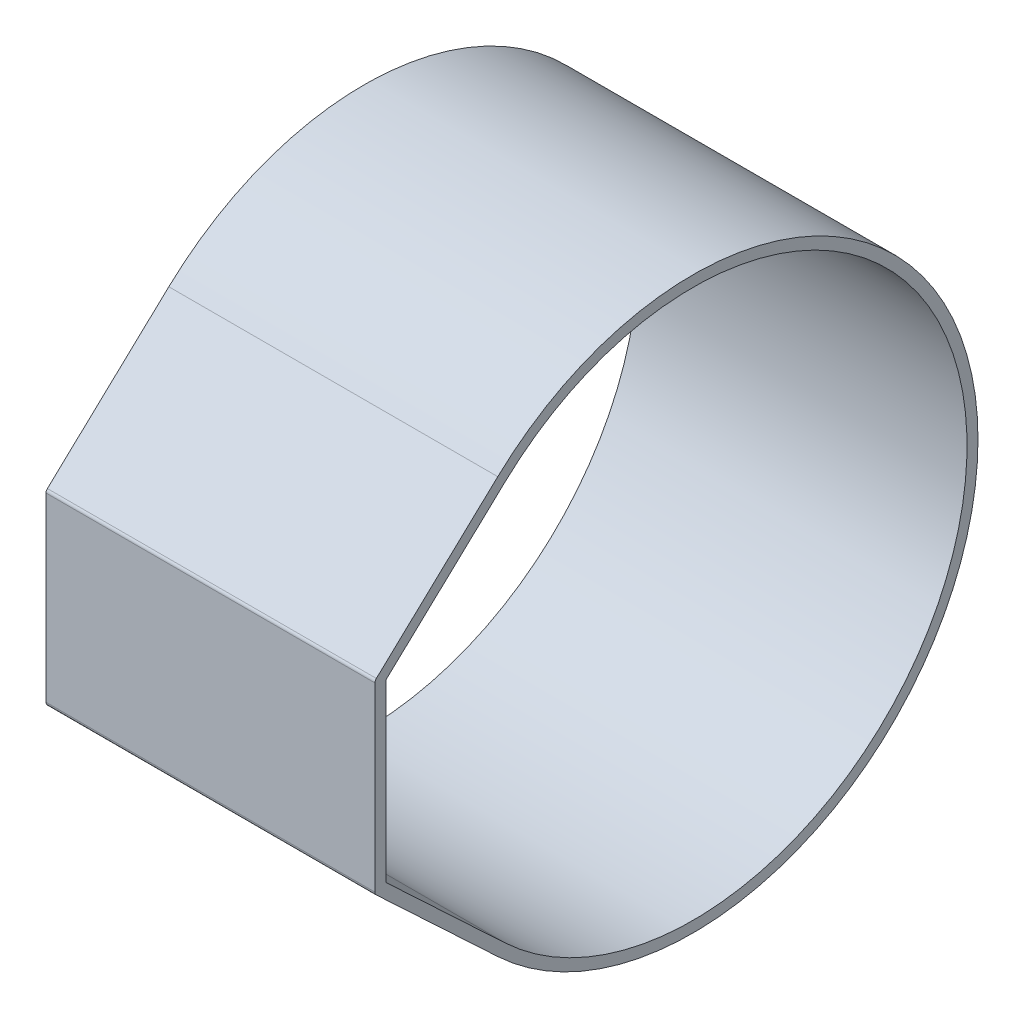
ISO-10303-21;
HEADER;
FILE_DESCRIPTION(('STEP AP214'),'2;1');
FILE_NAME('part.step','',(''),(''),'','','');
FILE_SCHEMA(('AUTOMOTIVE_DESIGN { 1 0 10303 214 1 1 1 1 }'));
ENDSEC;
DATA;
#1=APPLICATION_CONTEXT('core data for automotive mechanical design processes');
#2=APPLICATION_PROTOCOL_DEFINITION('international standard','automotive_design',2000,#1);
#3=PRODUCT_CONTEXT('',#1,'mechanical');
#4=PRODUCT('Part','Part','',(#3));
#5=PRODUCT_RELATED_PRODUCT_CATEGORY('part','',(#4));
#6=PRODUCT_DEFINITION_FORMATION('','',#4);
#7=PRODUCT_DEFINITION_CONTEXT('part definition',#1,'design');
#8=PRODUCT_DEFINITION('design','',#6,#7);
#9=PRODUCT_DEFINITION_SHAPE('','',#8);
#10=(LENGTH_UNIT() NAMED_UNIT(*) SI_UNIT(.MILLI.,.METRE.));
#11=(NAMED_UNIT(*) PLANE_ANGLE_UNIT() SI_UNIT($,.RADIAN.));
#12=(NAMED_UNIT(*) SI_UNIT($,.STERADIAN.) SOLID_ANGLE_UNIT());
#13=UNCERTAINTY_MEASURE_WITH_UNIT(LENGTH_MEASURE(1.E-05),#10,'distance_accuracy_value','');
#14=(GEOMETRIC_REPRESENTATION_CONTEXT(3) GLOBAL_UNCERTAINTY_ASSIGNED_CONTEXT((#13)) GLOBAL_UNIT_ASSIGNED_CONTEXT((#10,
#11,#12)) REPRESENTATION_CONTEXT('',''));
#15=CARTESIAN_POINT('',(0.,0.,0.));
#16=DIRECTION('',(0.,0.,1.));
#17=DIRECTION('',(1.,0.,0.));
#18=AXIS2_PLACEMENT_3D('',#15,#16,#17);
#19=CARTESIAN_POINT('',(-139.007123161513,667.332012286222,-386.357743681072));
#20=DIRECTION('',(-1.,0.,0.));
#21=DIRECTION('',(0.,0.,1.));
#22=AXIS2_PLACEMENT_3D('',#19,#20,#21);
#23=CYLINDRICAL_SURFACE('',#22,13.);
#24=CARTESIAN_POINT('',(-154.007123161513,667.332012286222,-386.357743681072));
#25=DIRECTION('',(-1.,0.,0.));
#26=DIRECTION('',(0.,0.,1.));
#27=AXIS2_PLACEMENT_3D('',#24,#25,#26);
#28=CIRCLE('',#27,13.);
#29=CARTESIAN_POINT('',(-154.007123161513,676.808049039048,-377.458039896165));
#30=VERTEX_POINT('',#29);
#31=CARTESIAN_POINT('',(-154.007123161513,657.855975533396,-377.458039896165));
#32=VERTEX_POINT('',#31);
#33=EDGE_CURVE('E164',#30,#32,#28,.T.);
#34=ORIENTED_EDGE('',*,*,#33,.F.);
#35=DIRECTION('',(-1.,0.,0.));
#36=VECTOR('',#35,1.);
#37=CARTESIAN_POINT('',(-139.007123161513,676.808049039048,-377.458039896165));
#38=LINE('',#37,#36);
#39=CARTESIAN_POINT('',(-139.007123161513,676.808049039048,-377.458039896165));
#40=VERTEX_POINT('',#39);
#41=EDGE_CURVE('E11',#40,#30,#38,.T.);
#42=ORIENTED_EDGE('',*,*,#41,.F.);
#43=CARTESIAN_POINT('',(-139.007123161513,667.332012286222,-386.357743681072));
#44=DIRECTION('',(-1.,0.,0.));
#45=DIRECTION('',(0.,0.,1.));
#46=AXIS2_PLACEMENT_3D('',#43,#44,#45);
#47=CIRCLE('',#46,13.);
#48=CARTESIAN_POINT('',(-139.007123161513,657.855975533396,-377.458039896165));
#49=VERTEX_POINT('',#48);
#50=EDGE_CURVE('E170',#40,#49,#47,.T.);
#51=ORIENTED_EDGE('',*,*,#50,.T.);
#52=DIRECTION('',(-1.,0.,0.));
#53=VECTOR('',#52,1.);
#54=CARTESIAN_POINT('',(-139.007123161513,657.855975533396,-377.458039896165));
#55=LINE('',#54,#53);
#56=EDGE_CURVE('E46',#49,#32,#55,.T.);
#57=ORIENTED_EDGE('',*,*,#56,.T.);
#58=EDGE_LOOP('',(#34,#42,#51,#57));
#59=FACE_BOUND('',#58,.T.);
#60=ADVANCED_FACE('F43',(#59),#23,.T.);
#61=CARTESIAN_POINT('',(-139.007123161513,671.607607945467,-371.920825161304));
#62=DIRECTION('',(0.,0.728925904063567,0.684592598838982));
#63=DIRECTION('',(0.,-0.684592598838982,0.728925904063567));
#64=AXIS2_PLACEMENT_3D('',#61,#62,#63);
#65=PLANE('',#64);
#66=DIRECTION('',(0.,0.684592598838982,-0.728925904063567));
#67=VECTOR('',#66,1.);
#68=CARTESIAN_POINT('',(-154.007123161513,671.607607945467,-371.920825161304));
#69=LINE('',#68,#67);
#70=CARTESIAN_POINT('',(-154.007123161513,671.607607945467,-371.920825161304));
#71=VERTEX_POINT('',#70);
#72=EDGE_CURVE('E175',#71,#30,#69,.T.);
#73=ORIENTED_EDGE('',*,*,#72,.F.);
#74=DIRECTION('',(-1.,0.,0.));
#75=VECTOR('',#74,1.);
#76=CARTESIAN_POINT('',(-139.007123161513,671.607607945467,-371.920825161304));
#77=LINE('',#76,#75);
#78=CARTESIAN_POINT('',(-139.007123161513,671.607607945467,-371.920825161304));
#79=VERTEX_POINT('',#78);
#80=EDGE_CURVE('E52',#79,#71,#77,.T.);
#81=ORIENTED_EDGE('',*,*,#80,.F.);
#82=DIRECTION('',(0.,0.684592598838982,-0.728925904063567));
#83=VECTOR('',#82,1.);
#84=CARTESIAN_POINT('',(-139.007123161513,671.607607945467,-371.920825161304));
#85=LINE('',#84,#83);
#86=EDGE_CURVE('E191',#79,#40,#85,.T.);
#87=ORIENTED_EDGE('',*,*,#86,.T.);
#88=ORIENTED_EDGE('',*,*,#41,.T.);
#89=EDGE_LOOP('',(#73,#81,#87,#88));
#90=FACE_BOUND('',#89,.T.);
#91=ADVANCED_FACE('F240',(#90),#65,.T.);
#92=CARTESIAN_POINT('',(-139.007123161513,671.461822764654,-372.057743681072));
#93=DIRECTION('',(-1.,0.,0.));
#94=DIRECTION('',(0.,0.,1.));
#95=AXIS2_PLACEMENT_3D('',#92,#93,#94);
#96=CYLINDRICAL_SURFACE('',#95,0.200000000000123);
#97=CARTESIAN_POINT('',(-154.007123161513,671.461822764654,-372.057743681072));
#98=DIRECTION('',(-1.,0.,0.));
#99=DIRECTION('',(0.,0.,1.));
#100=AXIS2_PLACEMENT_3D('',#97,#98,#99);
#101=CIRCLE('',#100,0.200000000000123);
#102=CARTESIAN_POINT('',(-154.007123161513,671.461822764654,-371.857743681072));
#103=VERTEX_POINT('',#102);
#104=EDGE_CURVE('E210',#103,#71,#101,.T.);
#105=ORIENTED_EDGE('',*,*,#104,.F.);
#106=DIRECTION('',(-1.,0.,0.));
#107=VECTOR('',#106,1.);
#108=CARTESIAN_POINT('',(-139.007123161513,671.461822764654,-371.857743681072));
#109=LINE('',#108,#107);
#110=CARTESIAN_POINT('',(-139.007123161513,671.461822764654,-371.857743681072));
#111=VERTEX_POINT('',#110);
#112=EDGE_CURVE('E219',#111,#103,#109,.T.);
#113=ORIENTED_EDGE('',*,*,#112,.F.);
#114=CARTESIAN_POINT('',(-139.007123161513,671.461822764654,-372.057743681072));
#115=DIRECTION('',(-1.,0.,0.));
#116=DIRECTION('',(0.,0.,1.));
#117=AXIS2_PLACEMENT_3D('',#114,#115,#116);
#118=CIRCLE('',#117,0.200000000000123);
#119=EDGE_CURVE('E187',#111,#79,#118,.T.);
#120=ORIENTED_EDGE('',*,*,#119,.T.);
#121=ORIENTED_EDGE('',*,*,#80,.T.);
#122=EDGE_LOOP('',(#105,#113,#120,#121));
#123=FACE_BOUND('',#122,.T.);
#124=ADVANCED_FACE('F251',(#123),#96,.T.);
#125=CARTESIAN_POINT('',(-139.007123161513,663.202201807789,-371.857743681072));
#126=DIRECTION('',(0.,0.,1.));
#127=DIRECTION('',(0.,-1.,0.));
#128=AXIS2_PLACEMENT_3D('',#125,#126,#127);
#129=PLANE('',#128);
#130=DIRECTION('',(0.,1.,0.));
#131=VECTOR('',#130,1.);
#132=CARTESIAN_POINT('',(-154.007123161513,663.202201807789,-371.857743681072));
#133=LINE('',#132,#131);
#134=CARTESIAN_POINT('',(-154.007123161513,663.202201807789,-371.857743681072));
#135=VERTEX_POINT('',#134);
#136=EDGE_CURVE('E206',#135,#103,#133,.T.);
#137=ORIENTED_EDGE('',*,*,#136,.F.);
#138=DIRECTION('',(-1.,0.,0.));
#139=VECTOR('',#138,1.);
#140=CARTESIAN_POINT('',(-139.007123161513,663.202201807789,-371.857743681072));
#141=LINE('',#140,#139);
#142=CARTESIAN_POINT('',(-139.007123161513,663.202201807789,-371.857743681072));
#143=VERTEX_POINT('',#142);
#144=EDGE_CURVE('E222',#143,#135,#141,.T.);
#145=ORIENTED_EDGE('',*,*,#144,.F.);
#146=DIRECTION('',(0.,1.,0.));
#147=VECTOR('',#146,1.);
#148=CARTESIAN_POINT('',(-139.007123161513,663.202201807789,-371.857743681072));
#149=LINE('',#148,#147);
#150=EDGE_CURVE('E183',#143,#111,#149,.T.);
#151=ORIENTED_EDGE('',*,*,#150,.T.);
#152=ORIENTED_EDGE('',*,*,#112,.T.);
#153=EDGE_LOOP('',(#137,#145,#151,#152));
#154=FACE_BOUND('',#153,.T.);
#155=ADVANCED_FACE('F249',(#154),#129,.T.);
#156=CARTESIAN_POINT('',(-139.007123161513,663.202201807789,-372.057743681072));
#157=DIRECTION('',(-1.,0.,0.));
#158=DIRECTION('',(0.,0.,1.));
#159=AXIS2_PLACEMENT_3D('',#156,#157,#158);
#160=CYLINDRICAL_SURFACE('',#159,0.200000000000012);
#161=CARTESIAN_POINT('',(-154.007123161513,663.202201807789,-372.057743681072));
#162=DIRECTION('',(-1.,0.,0.));
#163=DIRECTION('',(0.,0.,1.));
#164=AXIS2_PLACEMENT_3D('',#161,#162,#163);
#165=CIRCLE('',#164,0.200000000000012);
#166=CARTESIAN_POINT('',(-154.007123161513,663.056416626977,-371.920825161304));
#167=VERTEX_POINT('',#166);
#168=EDGE_CURVE('E202',#167,#135,#165,.T.);
#169=ORIENTED_EDGE('',*,*,#168,.F.);
#170=DIRECTION('',(-1.,0.,0.));
#171=VECTOR('',#170,1.);
#172=CARTESIAN_POINT('',(-139.007123161513,663.056416626977,-371.920825161304));
#173=LINE('',#172,#171);
#174=CARTESIAN_POINT('',(-139.007123161513,663.056416626977,-371.920825161304));
#175=VERTEX_POINT('',#174);
#176=EDGE_CURVE('E224',#175,#167,#173,.T.);
#177=ORIENTED_EDGE('',*,*,#176,.F.);
#178=CARTESIAN_POINT('',(-139.007123161513,663.202201807789,-372.057743681072));
#179=DIRECTION('',(-1.,0.,0.));
#180=DIRECTION('',(0.,0.,1.));
#181=AXIS2_PLACEMENT_3D('',#178,#179,#180);
#182=CIRCLE('',#181,0.200000000000012);
#183=EDGE_CURVE('E179',#175,#143,#182,.T.);
#184=ORIENTED_EDGE('',*,*,#183,.T.);
#185=ORIENTED_EDGE('',*,*,#144,.T.);
#186=EDGE_LOOP('',(#169,#177,#184,#185));
#187=FACE_BOUND('',#186,.T.);
#188=ADVANCED_FACE('F246',(#187),#160,.T.);
#189=CARTESIAN_POINT('',(-139.007123161513,657.855975533396,-377.458039896165));
#190=DIRECTION('',(0.,-0.72892590406359,0.684592598838958));
#191=DIRECTION('',(0.,-0.684592598838958,-0.72892590406359));
#192=AXIS2_PLACEMENT_3D('',#189,#190,#191);
#193=PLANE('',#192);
#194=DIRECTION('',(0.,0.684592598838958,0.72892590406359));
#195=VECTOR('',#194,1.);
#196=CARTESIAN_POINT('',(-154.007123161513,657.855975533396,-377.458039896165));
#197=LINE('',#196,#195);
#198=EDGE_CURVE('E198',#32,#167,#197,.T.);
#199=ORIENTED_EDGE('',*,*,#198,.F.);
#200=ORIENTED_EDGE('',*,*,#56,.F.);
#201=DIRECTION('',(0.,0.684592598838958,0.72892590406359));
#202=VECTOR('',#201,1.);
#203=CARTESIAN_POINT('',(-139.007123161513,657.855975533396,-377.458039896165));
#204=LINE('',#203,#202);
#205=EDGE_CURVE('E174',#49,#175,#204,.T.);
#206=ORIENTED_EDGE('',*,*,#205,.T.);
#207=ORIENTED_EDGE('',*,*,#176,.T.);
#208=EDGE_LOOP('',(#199,#200,#206,#207));
#209=FACE_BOUND('',#208,.T.);
#210=ADVANCED_FACE('F234',(#209),#193,.T.);
#211=CARTESIAN_POINT('',(-139.007123161513,667.332012286222,-386.357743681072));
#212=DIRECTION('',(-1.,0.,0.));
#213=DIRECTION('',(0.,0.,1.));
#214=AXIS2_PLACEMENT_3D('',#211,#212,#213);
#215=PLANE('',#214);
#216=DIRECTION('',(0.,0.684592598838942,-0.728925904063605));
#217=VECTOR('',#216,1.);
#218=CARTESIAN_POINT('',(-139.007123161513,676.443586087017,-377.800336195585));
#219=LINE('',#218,#217);
#220=CARTESIAN_POINT('',(-139.007123161513,671.332012286222,-372.357743681072));
#221=VERTEX_POINT('',#220);
#222=CARTESIAN_POINT('',(-139.007123161513,676.443586087017,-377.800336195585));
#223=VERTEX_POINT('',#222);
#224=EDGE_CURVE('E130',#221,#223,#219,.T.);
#225=ORIENTED_EDGE('',*,*,#224,.T.);
#226=CARTESIAN_POINT('',(-139.007123161513,667.332012286222,-386.357743681072));
#227=DIRECTION('',(-1.,0.,0.));
#228=DIRECTION('',(0.,0.,-1.));
#229=AXIS2_PLACEMENT_3D('',#226,#227,#228);
#230=CIRCLE('',#229,12.4999999999998);
#231=CARTESIAN_POINT('',(-139.007123161513,658.220438485427,-377.800336195585));
#232=VERTEX_POINT('',#231);
#233=EDGE_CURVE('E123',#223,#232,#230,.T.);
#234=ORIENTED_EDGE('',*,*,#233,.T.);
#235=DIRECTION('',(0.,0.684592598838983,0.728925904063566));
#236=VECTOR('',#235,1.);
#237=CARTESIAN_POINT('',(-139.007123161513,663.332012286222,-372.357743681072));
#238=LINE('',#237,#236);
#239=CARTESIAN_POINT('',(-139.007123161513,663.332012286222,-372.357743681072));
#240=VERTEX_POINT('',#239);
#241=EDGE_CURVE('E133',#232,#240,#238,.T.);
#242=ORIENTED_EDGE('',*,*,#241,.T.);
#243=DIRECTION('',(0.,1.,0.));
#244=VECTOR('',#243,1.);
#245=CARTESIAN_POINT('',(-139.007123161513,671.332012286222,-372.357743681072));
#246=LINE('',#245,#244);
#247=EDGE_CURVE('E60',#240,#221,#246,.T.);
#248=ORIENTED_EDGE('',*,*,#247,.T.);
#249=EDGE_LOOP('',(#225,#234,#242,#248));
#250=FACE_BOUND('',#249,.T.);
#251=ORIENTED_EDGE('',*,*,#50,.F.);
#252=ORIENTED_EDGE('',*,*,#86,.F.);
#253=ORIENTED_EDGE('',*,*,#119,.F.);
#254=ORIENTED_EDGE('',*,*,#150,.F.);
#255=ORIENTED_EDGE('',*,*,#183,.F.);
#256=ORIENTED_EDGE('',*,*,#205,.F.);
#257=EDGE_LOOP('',(#251,#252,#253,#254,#255,#256));
#258=FACE_BOUND('',#257,.T.);
#259=ADVANCED_FACE('F138',(#250,#258),#215,.F.);
#260=CARTESIAN_POINT('',(-154.007123161513,667.332012286222,-386.357743681072));
#261=DIRECTION('',(-1.,0.,0.));
#262=DIRECTION('',(0.,0.,1.));
#263=AXIS2_PLACEMENT_3D('',#260,#261,#262);
#264=PLANE('',#263);
#265=CARTESIAN_POINT('',(-154.007123161513,667.332012286222,-386.357743681072));
#266=DIRECTION('',(-1.,0.,0.));
#267=DIRECTION('',(0.,0.,-1.));
#268=AXIS2_PLACEMENT_3D('',#265,#266,#267);
#269=CIRCLE('',#268,12.4999999999998);
#270=CARTESIAN_POINT('',(-154.007123161513,676.443586087017,-377.800336195585));
#271=VERTEX_POINT('',#270);
#272=CARTESIAN_POINT('',(-154.007123161513,658.220438485427,-377.800336195585));
#273=VERTEX_POINT('',#272);
#274=EDGE_CURVE('E68',#271,#273,#269,.T.);
#275=ORIENTED_EDGE('',*,*,#274,.F.);
#276=DIRECTION('',(0.,0.684592598838942,-0.728925904063605));
#277=VECTOR('',#276,1.);
#278=CARTESIAN_POINT('',(-154.007123161513,676.443586087017,-377.800336195585));
#279=LINE('',#278,#277);
#280=CARTESIAN_POINT('',(-154.007123161513,671.332012286222,-372.357743681072));
#281=VERTEX_POINT('',#280);
#282=EDGE_CURVE('E142',#281,#271,#279,.T.);
#283=ORIENTED_EDGE('',*,*,#282,.F.);
#284=DIRECTION('',(0.,1.,0.));
#285=VECTOR('',#284,1.);
#286=CARTESIAN_POINT('',(-154.007123161513,671.332012286222,-372.357743681072));
#287=LINE('',#286,#285);
#288=CARTESIAN_POINT('',(-154.007123161513,663.332012286222,-372.357743681072));
#289=VERTEX_POINT('',#288);
#290=EDGE_CURVE('E146',#289,#281,#287,.T.);
#291=ORIENTED_EDGE('',*,*,#290,.F.);
#292=DIRECTION('',(0.,0.684592598838983,0.728925904063566));
#293=VECTOR('',#292,1.);
#294=CARTESIAN_POINT('',(-154.007123161513,663.332012286222,-372.357743681072));
#295=LINE('',#294,#293);
#296=EDGE_CURVE('E155',#273,#289,#295,.T.);
#297=ORIENTED_EDGE('',*,*,#296,.F.);
#298=EDGE_LOOP('',(#275,#283,#291,#297));
#299=FACE_BOUND('',#298,.T.);
#300=ORIENTED_EDGE('',*,*,#33,.T.);
#301=ORIENTED_EDGE('',*,*,#198,.T.);
#302=ORIENTED_EDGE('',*,*,#168,.T.);
#303=ORIENTED_EDGE('',*,*,#136,.T.);
#304=ORIENTED_EDGE('',*,*,#104,.T.);
#305=ORIENTED_EDGE('',*,*,#72,.T.);
#306=EDGE_LOOP('',(#300,#301,#302,#303,#304,#305));
#307=FACE_BOUND('',#306,.T.);
#308=ADVANCED_FACE('F236',(#299,#307),#264,.T.);
#309=CARTESIAN_POINT('',(-139.007123161513,667.332012286222,-386.357743681072));
#310=DIRECTION('',(-1.,0.,0.));
#311=DIRECTION('',(0.,0.,1.));
#312=AXIS2_PLACEMENT_3D('',#309,#310,#311);
#313=CYLINDRICAL_SURFACE('',#312,12.4999999999998);
#314=ORIENTED_EDGE('',*,*,#274,.T.);
#315=DIRECTION('',(-1.,0.,0.));
#316=VECTOR('',#315,1.);
#317=CARTESIAN_POINT('',(-139.007123161513,658.220438485427,-377.800336195585));
#318=LINE('',#317,#316);
#319=EDGE_CURVE('E119',#232,#273,#318,.T.);
#320=ORIENTED_EDGE('',*,*,#319,.F.);
#321=ORIENTED_EDGE('',*,*,#233,.F.);
#322=DIRECTION('',(-1.,0.,0.));
#323=VECTOR('',#322,1.);
#324=CARTESIAN_POINT('',(-139.007123161513,676.443586087017,-377.800336195585));
#325=LINE('',#324,#323);
#326=EDGE_CURVE('E161',#223,#271,#325,.T.);
#327=ORIENTED_EDGE('',*,*,#326,.T.);
#328=EDGE_LOOP('',(#314,#320,#321,#327));
#329=FACE_BOUND('',#328,.T.);
#330=ADVANCED_FACE('F121',(#329),#313,.F.);
#331=CARTESIAN_POINT('',(-139.007123161513,676.443586087017,-377.800336195585));
#332=DIRECTION('',(0.,0.728925904063605,0.684592598838942));
#333=DIRECTION('',(0.,-0.684592598838942,0.728925904063605));
#334=AXIS2_PLACEMENT_3D('',#331,#332,#333);
#335=PLANE('',#334);
#336=ORIENTED_EDGE('',*,*,#282,.T.);
#337=ORIENTED_EDGE('',*,*,#326,.F.);
#338=ORIENTED_EDGE('',*,*,#224,.F.);
#339=DIRECTION('',(-1.,0.,0.));
#340=VECTOR('',#339,1.);
#341=CARTESIAN_POINT('',(-139.007123161513,671.332012286222,-372.357743681072));
#342=LINE('',#341,#340);
#343=EDGE_CURVE('E165',#221,#281,#342,.T.);
#344=ORIENTED_EDGE('',*,*,#343,.T.);
#345=EDGE_LOOP('',(#336,#337,#338,#344));
#346=FACE_BOUND('',#345,.T.);
#347=ADVANCED_FACE('F325',(#346),#335,.F.);
#348=CARTESIAN_POINT('',(-139.007123161513,671.332012286222,-372.357743681072));
#349=DIRECTION('',(0.,0.,1.));
#350=DIRECTION('',(1.,0.,0.));
#351=AXIS2_PLACEMENT_3D('',#348,#349,#350);
#352=PLANE('',#351);
#353=ORIENTED_EDGE('',*,*,#290,.T.);
#354=ORIENTED_EDGE('',*,*,#343,.F.);
#355=ORIENTED_EDGE('',*,*,#247,.F.);
#356=DIRECTION('',(-1.,0.,0.));
#357=VECTOR('',#356,1.);
#358=CARTESIAN_POINT('',(-139.007123161513,663.332012286222,-372.357743681072));
#359=LINE('',#358,#357);
#360=EDGE_CURVE('E129',#240,#289,#359,.T.);
#361=ORIENTED_EDGE('',*,*,#360,.T.);
#362=EDGE_LOOP('',(#353,#354,#355,#361));
#363=FACE_BOUND('',#362,.T.);
#364=ADVANCED_FACE('F335',(#363),#352,.F.);
#365=CARTESIAN_POINT('',(-139.007123161513,663.332012286222,-372.357743681072));
#366=DIRECTION('',(0.,-0.728925904063566,0.684592598838983));
#367=DIRECTION('',(0.,-0.684592598838983,-0.728925904063566));
#368=AXIS2_PLACEMENT_3D('',#365,#366,#367);
#369=PLANE('',#368);
#370=ORIENTED_EDGE('',*,*,#296,.T.);
#371=ORIENTED_EDGE('',*,*,#360,.F.);
#372=ORIENTED_EDGE('',*,*,#241,.F.);
#373=ORIENTED_EDGE('',*,*,#319,.T.);
#374=EDGE_LOOP('',(#370,#371,#372,#373));
#375=FACE_BOUND('',#374,.T.);
#376=ADVANCED_FACE('F134',(#375),#369,.F.);
#377=CLOSED_SHELL('',(#60,#91,#124,#155,#188,#210,#259,#308,#330,#347,#364,#376));
#378=MANIFOLD_SOLID_BREP('B2',#377);
#379=ADVANCED_BREP_SHAPE_REPRESENTATION('',(#18,#378),#14);
#380=SHAPE_DEFINITION_REPRESENTATION(#9,#379);
ENDSEC;
END-ISO-10303-21;
